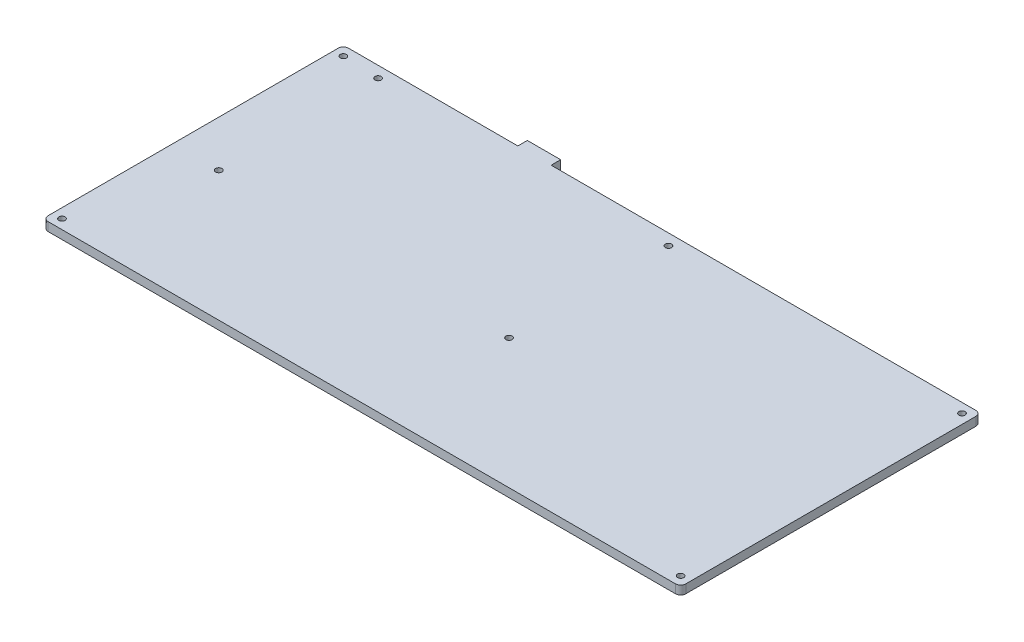
ISO-10303-21;
HEADER;
FILE_DESCRIPTION(('STEP AP214'),'2;1');
FILE_NAME('part.step','',(''),(''),'','','');
FILE_SCHEMA(('AUTOMOTIVE_DESIGN { 1 0 10303 214 1 1 1 1 }'));
ENDSEC;
DATA;
#1=APPLICATION_CONTEXT('core data for automotive mechanical design processes');
#2=APPLICATION_PROTOCOL_DEFINITION('international standard','automotive_design',2000,#1);
#3=PRODUCT_CONTEXT('',#1,'mechanical');
#4=PRODUCT('Part','Part','',(#3));
#5=PRODUCT_RELATED_PRODUCT_CATEGORY('part','',(#4));
#6=PRODUCT_DEFINITION_FORMATION('','',#4);
#7=PRODUCT_DEFINITION_CONTEXT('part definition',#1,'design');
#8=PRODUCT_DEFINITION('design','',#6,#7);
#9=PRODUCT_DEFINITION_SHAPE('','',#8);
#10=(LENGTH_UNIT() NAMED_UNIT(*) SI_UNIT(.MILLI.,.METRE.));
#11=(NAMED_UNIT(*) PLANE_ANGLE_UNIT() SI_UNIT($,.RADIAN.));
#12=(NAMED_UNIT(*) SI_UNIT($,.STERADIAN.) SOLID_ANGLE_UNIT());
#13=UNCERTAINTY_MEASURE_WITH_UNIT(LENGTH_MEASURE(1.E-05),#10,'distance_accuracy_value','');
#14=(GEOMETRIC_REPRESENTATION_CONTEXT(3) GLOBAL_UNCERTAINTY_ASSIGNED_CONTEXT((#13)) GLOBAL_UNIT_ASSIGNED_CONTEXT((#10,
#11,#12)) REPRESENTATION_CONTEXT('',''));
#15=CARTESIAN_POINT('',(0.,0.,0.));
#16=DIRECTION('',(0.,0.,1.));
#17=DIRECTION('',(1.,0.,0.));
#18=AXIS2_PLACEMENT_3D('',#15,#16,#17);
#19=CARTESIAN_POINT('',(0.,0.,0.));
#20=DIRECTION('',(0.,1.,0.));
#21=DIRECTION('',(0.,0.,1.));
#22=AXIS2_PLACEMENT_3D('',#19,#20,#21);
#23=PLANE('',#22);
#24=DIRECTION('',(1.,0.,0.));
#25=VECTOR('',#24,1.);
#26=CARTESIAN_POINT('',(-30.269137665192,0.,-43.6579047044926));
#27=LINE('',#26,#25);
#28=CARTESIAN_POINT('',(-30.269137665192,0.,-43.6579047044926));
#29=VERTEX_POINT('',#28);
#30=CARTESIAN_POINT('',(92.6109493963581,0.,-43.6579047044926));
#31=VERTEX_POINT('',#30);
#32=EDGE_CURVE('E136',#29,#31,#27,.T.);
#33=ORIENTED_EDGE('',*,*,#32,.T.);
#34=CARTESIAN_POINT('',(92.6109493963581,0.,-42.1579047044926));
#35=DIRECTION('',(0.,1.,0.));
#36=DIRECTION('',(0.,0.,1.));
#37=AXIS2_PLACEMENT_3D('',#34,#35,#36);
#38=CIRCLE('',#37,1.5);
#39=CARTESIAN_POINT('',(94.1109493963581,0.,-42.1579047044926));
#40=VERTEX_POINT('',#39);
#41=EDGE_CURVE('E202',#31,#40,#38,.F.);
#42=ORIENTED_EDGE('',*,*,#41,.T.);
#43=DIRECTION('',(0.,0.,-1.));
#44=VECTOR('',#43,1.);
#45=CARTESIAN_POINT('',(94.1109493963581,0.,43.2563883655075));
#46=LINE('',#45,#44);
#47=CARTESIAN_POINT('',(94.1109493963581,0.,41.7563883655075));
#48=VERTEX_POINT('',#47);
#49=EDGE_CURVE('E172',#48,#40,#46,.T.);
#50=ORIENTED_EDGE('',*,*,#49,.F.);
#51=CARTESIAN_POINT('',(92.6109493963581,0.,41.7563883655075));
#52=DIRECTION('',(0.,1.,0.));
#53=DIRECTION('',(0.,0.,1.));
#54=AXIS2_PLACEMENT_3D('',#51,#52,#53);
#55=CIRCLE('',#54,1.5);
#56=CARTESIAN_POINT('',(92.6109493963581,0.,43.2563883655075));
#57=VERTEX_POINT('',#56);
#58=EDGE_CURVE('E200',#48,#57,#55,.F.);
#59=ORIENTED_EDGE('',*,*,#58,.T.);
#60=DIRECTION('',(1.,0.,0.));
#61=VECTOR('',#60,1.);
#62=CARTESIAN_POINT('',(-90.3890506036419,0.,43.2563883655075));
#63=LINE('',#62,#61);
#64=CARTESIAN_POINT('',(-88.8890506036419,0.,43.2563883655075));
#65=VERTEX_POINT('',#64);
#66=EDGE_CURVE('E169',#65,#57,#63,.T.);
#67=ORIENTED_EDGE('',*,*,#66,.F.);
#68=CARTESIAN_POINT('',(-88.8890506036419,0.,41.7563883655075));
#69=DIRECTION('',(0.,1.,0.));
#70=DIRECTION('',(0.,0.,1.));
#71=AXIS2_PLACEMENT_3D('',#68,#69,#70);
#72=CIRCLE('',#71,1.5);
#73=CARTESIAN_POINT('',(-90.3890506036419,0.,41.7563883655075));
#74=VERTEX_POINT('',#73);
#75=EDGE_CURVE('E198',#65,#74,#72,.F.);
#76=ORIENTED_EDGE('',*,*,#75,.T.);
#77=DIRECTION('',(0.,0.,-1.));
#78=VECTOR('',#77,1.);
#79=CARTESIAN_POINT('',(-90.3890506036419,0.,43.2563883655075));
#80=LINE('',#79,#78);
#81=CARTESIAN_POINT('',(-90.3890506036419,0.,-42.1579047044926));
#82=VERTEX_POINT('',#81);
#83=EDGE_CURVE('E187',#74,#82,#80,.T.);
#84=ORIENTED_EDGE('',*,*,#83,.T.);
#85=CARTESIAN_POINT('',(-88.8890506036419,0.,-42.1579047044926));
#86=DIRECTION('',(0.,1.,0.));
#87=DIRECTION('',(0.,0.,1.));
#88=AXIS2_PLACEMENT_3D('',#85,#86,#87);
#89=CIRCLE('',#88,1.5);
#90=CARTESIAN_POINT('',(-88.8890506036419,0.,-43.6579047044926));
#91=VERTEX_POINT('',#90);
#92=EDGE_CURVE('E196',#82,#91,#89,.F.);
#93=ORIENTED_EDGE('',*,*,#92,.T.);
#94=DIRECTION('',(1.,0.,0.));
#95=VECTOR('',#94,1.);
#96=CARTESIAN_POINT('',(-90.3890506036419,0.,-43.6579047044926));
#97=LINE('',#96,#95);
#98=CARTESIAN_POINT('',(-39.909137665192,0.,-43.6579047044926));
#99=VERTEX_POINT('',#98);
#100=EDGE_CURVE('E185',#91,#99,#97,.T.);
#101=ORIENTED_EDGE('',*,*,#100,.T.);
#102=DIRECTION('',(0.,0.,-1.));
#103=VECTOR('',#102,1.);
#104=CARTESIAN_POINT('',(-39.909137665192,0.,-43.6579047044926));
#105=LINE('',#104,#103);
#106=CARTESIAN_POINT('',(-39.909137665192,0.,-46.4079047044925));
#107=VERTEX_POINT('',#106);
#108=EDGE_CURVE('E182',#99,#107,#105,.T.);
#109=ORIENTED_EDGE('',*,*,#108,.T.);
#110=DIRECTION('',(1.,0.,0.));
#111=VECTOR('',#110,1.);
#112=CARTESIAN_POINT('',(-39.909137665192,0.,-46.4079047044925));
#113=LINE('',#112,#111);
#114=CARTESIAN_POINT('',(-30.269137665192,0.,-46.4079047044925));
#115=VERTEX_POINT('',#114);
#116=EDGE_CURVE('E179',#107,#115,#113,.T.);
#117=ORIENTED_EDGE('',*,*,#116,.T.);
#118=DIRECTION('',(0.,0.,-1.));
#119=VECTOR('',#118,1.);
#120=CARTESIAN_POINT('',(-30.269137665192,0.,-43.6579047044926));
#121=LINE('',#120,#119);
#122=EDGE_CURVE('E177',#29,#115,#121,.T.);
#123=ORIENTED_EDGE('',*,*,#122,.F.);
#124=EDGE_LOOP('',(#33,#42,#50,#59,#67,#76,#84,#93,#101,#109,#117,#123));
#125=FACE_BOUND('',#124,.T.);
#126=CARTESIAN_POINT('',(-77.089050603642,0.,-40.4079047044926));
#127=DIRECTION('',(0.,-1.,0.));
#128=DIRECTION('',(0.,0.,-1.));
#129=AXIS2_PLACEMENT_3D('',#126,#127,#128);
#130=CIRCLE('',#129,1.8);
#131=CARTESIAN_POINT('',(-77.089050603642,0.,-42.2079047044925));
#132=VERTEX_POINT('',#131);
#133=EDGE_CURVE('E245',#132,#132,#130,.T.);
#134=ORIENTED_EDGE('',*,*,#133,.F.);
#135=EDGE_LOOP('',(#134));
#136=FACE_BOUND('',#135,.T.);
#137=CARTESIAN_POINT('',(6.91094939635803,0.,-40.4079047044925));
#138=DIRECTION('',(0.,-1.,0.));
#139=DIRECTION('',(0.,0.,-1.));
#140=AXIS2_PLACEMENT_3D('',#137,#138,#139);
#141=CIRCLE('',#140,1.8);
#142=CARTESIAN_POINT('',(6.91094939635803,0.,-42.2079047044925));
#143=VERTEX_POINT('',#142);
#144=EDGE_CURVE('E254',#143,#143,#141,.T.);
#145=ORIENTED_EDGE('',*,*,#144,.F.);
#146=EDGE_LOOP('',(#145));
#147=FACE_BOUND('',#146,.T.);
#148=CARTESIAN_POINT('',(6.91094939635803,0.,5.69609529550746));
#149=DIRECTION('',(0.,-1.,0.));
#150=DIRECTION('',(0.,0.,-1.));
#151=AXIS2_PLACEMENT_3D('',#148,#149,#150);
#152=CIRCLE('',#151,1.8);
#153=CARTESIAN_POINT('',(6.91094939635803,0.,3.89609529550746));
#154=VERTEX_POINT('',#153);
#155=EDGE_CURVE('E263',#154,#154,#152,.T.);
#156=ORIENTED_EDGE('',*,*,#155,.F.);
#157=EDGE_LOOP('',(#156));
#158=FACE_BOUND('',#157,.T.);
#159=CARTESIAN_POINT('',(-77.089050603642,0.,5.69609529550745));
#160=DIRECTION('',(0.,-1.,0.));
#161=DIRECTION('',(0.,0.,-1.));
#162=AXIS2_PLACEMENT_3D('',#159,#160,#161);
#163=CIRCLE('',#162,1.8);
#164=CARTESIAN_POINT('',(-77.089050603642,0.,3.89609529550745));
#165=VERTEX_POINT('',#164);
#166=EDGE_CURVE('E272',#165,#165,#163,.T.);
#167=ORIENTED_EDGE('',*,*,#166,.F.);
#168=EDGE_LOOP('',(#167));
#169=FACE_BOUND('',#168,.T.);
#170=CARTESIAN_POINT('',(-87.6390506036419,0.,-40.9079047044926));
#171=DIRECTION('',(0.,-1.,0.));
#172=DIRECTION('',(0.,0.,-1.));
#173=AXIS2_PLACEMENT_3D('',#170,#171,#172);
#174=CIRCLE('',#173,1.8);
#175=CARTESIAN_POINT('',(-87.6390506036419,0.,-42.7079047044926));
#176=VERTEX_POINT('',#175);
#177=EDGE_CURVE('E281',#176,#176,#174,.T.);
#178=ORIENTED_EDGE('',*,*,#177,.F.);
#179=EDGE_LOOP('',(#178));
#180=FACE_BOUND('',#179,.T.);
#181=CARTESIAN_POINT('',(91.3609493963581,0.,-40.9079047044926));
#182=DIRECTION('',(0.,-1.,0.));
#183=DIRECTION('',(0.,0.,-1.));
#184=AXIS2_PLACEMENT_3D('',#181,#182,#183);
#185=CIRCLE('',#184,1.8);
#186=CARTESIAN_POINT('',(91.3609493963581,0.,-42.7079047044926));
#187=VERTEX_POINT('',#186);
#188=EDGE_CURVE('E290',#187,#187,#185,.T.);
#189=ORIENTED_EDGE('',*,*,#188,.F.);
#190=EDGE_LOOP('',(#189));
#191=FACE_BOUND('',#190,.T.);
#192=CARTESIAN_POINT('',(91.3609493963581,0.,40.5063883655075));
#193=DIRECTION('',(0.,-1.,0.));
#194=DIRECTION('',(0.,0.,-1.));
#195=AXIS2_PLACEMENT_3D('',#192,#193,#194);
#196=CIRCLE('',#195,1.8);
#197=CARTESIAN_POINT('',(91.3609493963581,0.,38.7063883655075));
#198=VERTEX_POINT('',#197);
#199=EDGE_CURVE('E299',#198,#198,#196,.T.);
#200=ORIENTED_EDGE('',*,*,#199,.F.);
#201=EDGE_LOOP('',(#200));
#202=FACE_BOUND('',#201,.T.);
#203=CARTESIAN_POINT('',(-87.6390506036419,0.,40.5063883655075));
#204=DIRECTION('',(0.,-1.,0.));
#205=DIRECTION('',(0.,0.,-1.));
#206=AXIS2_PLACEMENT_3D('',#203,#204,#205);
#207=CIRCLE('',#206,1.8);
#208=CARTESIAN_POINT('',(-87.6390506036419,0.,38.7063883655075));
#209=VERTEX_POINT('',#208);
#210=EDGE_CURVE('E308',#209,#209,#207,.T.);
#211=ORIENTED_EDGE('',*,*,#210,.F.);
#212=EDGE_LOOP('',(#211));
#213=FACE_BOUND('',#212,.T.);
#214=ADVANCED_FACE('F39',(#125,#136,#147,#158,#169,#180,#191,#202,#213),#23,.F.);
#215=CARTESIAN_POINT('',(-90.3890506036419,2.5,43.2563883655075));
#216=DIRECTION('',(0.,0.,-1.));
#217=DIRECTION('',(-1.,0.,0.));
#218=AXIS2_PLACEMENT_3D('',#215,#216,#217);
#219=PLANE('',#218);
#220=ORIENTED_EDGE('',*,*,#66,.T.);
#221=DIRECTION('',(0.,-1.,0.));
#222=VECTOR('',#221,1.);
#223=CARTESIAN_POINT('',(92.6109493963581,2.5,43.2563883655075));
#224=LINE('',#223,#222);
#225=CARTESIAN_POINT('',(92.6109493963581,2.5,43.2563883655075));
#226=VERTEX_POINT('',#225);
#227=EDGE_CURVE('E218',#57,#226,#224,.F.);
#228=ORIENTED_EDGE('',*,*,#227,.T.);
#229=DIRECTION('',(1.,0.,0.));
#230=VECTOR('',#229,1.);
#231=CARTESIAN_POINT('',(-90.3890506036419,2.5,43.2563883655075));
#232=LINE('',#231,#230);
#233=CARTESIAN_POINT('',(-88.8890506036419,2.5,43.2563883655075));
#234=VERTEX_POINT('',#233);
#235=EDGE_CURVE('E156',#234,#226,#232,.T.);
#236=ORIENTED_EDGE('',*,*,#235,.F.);
#237=DIRECTION('',(0.,-1.,0.));
#238=VECTOR('',#237,1.);
#239=CARTESIAN_POINT('',(-88.8890506036419,0.,43.2563883655075));
#240=LINE('',#239,#238);
#241=EDGE_CURVE('E215',#234,#65,#240,.T.);
#242=ORIENTED_EDGE('',*,*,#241,.T.);
#243=EDGE_LOOP('',(#220,#228,#236,#242));
#244=FACE_BOUND('',#243,.T.);
#245=ADVANCED_FACE('F235',(#244),#219,.F.);
#246=CARTESIAN_POINT('',(94.1109493963581,2.5,43.2563883655075));
#247=DIRECTION('',(-1.,0.,0.));
#248=DIRECTION('',(0.,0.,1.));
#249=AXIS2_PLACEMENT_3D('',#246,#247,#248);
#250=PLANE('',#249);
#251=ORIENTED_EDGE('',*,*,#49,.T.);
#252=DIRECTION('',(0.,-1.,0.));
#253=VECTOR('',#252,1.);
#254=CARTESIAN_POINT('',(94.1109493963581,2.5,-42.1579047044926));
#255=LINE('',#254,#253);
#256=CARTESIAN_POINT('',(94.1109493963581,2.5,-42.1579047044926));
#257=VERTEX_POINT('',#256);
#258=EDGE_CURVE('E207',#40,#257,#255,.F.);
#259=ORIENTED_EDGE('',*,*,#258,.T.);
#260=DIRECTION('',(0.,0.,-1.));
#261=VECTOR('',#260,1.);
#262=CARTESIAN_POINT('',(94.1109493963581,2.5,43.2563883655075));
#263=LINE('',#262,#261);
#264=CARTESIAN_POINT('',(94.1109493963581,2.5,41.7563883655075));
#265=VERTEX_POINT('',#264);
#266=EDGE_CURVE('E154',#265,#257,#263,.T.);
#267=ORIENTED_EDGE('',*,*,#266,.F.);
#268=DIRECTION('',(0.,-1.,0.));
#269=VECTOR('',#268,1.);
#270=CARTESIAN_POINT('',(94.1109493963581,2.5,41.7563883655075));
#271=LINE('',#270,#269);
#272=EDGE_CURVE('E204',#265,#48,#271,.T.);
#273=ORIENTED_EDGE('',*,*,#272,.T.);
#274=EDGE_LOOP('',(#251,#259,#267,#273));
#275=FACE_BOUND('',#274,.T.);
#276=ADVANCED_FACE('F319',(#275),#250,.F.);
#277=CARTESIAN_POINT('',(-30.269137665192,2.5,-43.6579047044926));
#278=DIRECTION('',(0.,0.,-1.));
#279=DIRECTION('',(-1.,0.,0.));
#280=AXIS2_PLACEMENT_3D('',#277,#278,#279);
#281=PLANE('',#280);
#282=DIRECTION('',(1.,0.,0.));
#283=VECTOR('',#282,1.);
#284=CARTESIAN_POINT('',(-30.269137665192,2.5,-43.6579047044926));
#285=LINE('',#284,#283);
#286=CARTESIAN_POINT('',(-30.269137665192,2.5,-43.6579047044926));
#287=VERTEX_POINT('',#286);
#288=CARTESIAN_POINT('',(92.6109493963581,2.5,-43.6579047044926));
#289=VERTEX_POINT('',#288);
#290=EDGE_CURVE('E133',#287,#289,#285,.T.);
#291=ORIENTED_EDGE('',*,*,#290,.T.);
#292=DIRECTION('',(0.,-1.,0.));
#293=VECTOR('',#292,1.);
#294=CARTESIAN_POINT('',(92.6109493963581,0.,-43.6579047044926));
#295=LINE('',#294,#293);
#296=EDGE_CURVE('E140',#289,#31,#295,.T.);
#297=ORIENTED_EDGE('',*,*,#296,.T.);
#298=ORIENTED_EDGE('',*,*,#32,.F.);
#299=DIRECTION('',(0.,-1.,0.));
#300=VECTOR('',#299,1.);
#301=CARTESIAN_POINT('',(-30.269137665192,2.5,-43.6579047044926));
#302=LINE('',#301,#300);
#303=EDGE_CURVE('E128',#287,#29,#302,.T.);
#304=ORIENTED_EDGE('',*,*,#303,.F.);
#305=EDGE_LOOP('',(#291,#297,#298,#304));
#306=FACE_BOUND('',#305,.T.);
#307=ADVANCED_FACE('F130',(#306),#281,.T.);
#308=CARTESIAN_POINT('',(-30.269137665192,2.5,-43.6579047044926));
#309=DIRECTION('',(-1.,0.,0.));
#310=DIRECTION('',(0.,0.,1.));
#311=AXIS2_PLACEMENT_3D('',#308,#309,#310);
#312=PLANE('',#311);
#313=ORIENTED_EDGE('',*,*,#122,.T.);
#314=DIRECTION('',(0.,-1.,0.));
#315=VECTOR('',#314,1.);
#316=CARTESIAN_POINT('',(-30.269137665192,2.5,-46.4079047044925));
#317=LINE('',#316,#315);
#318=CARTESIAN_POINT('',(-30.269137665192,2.5,-46.4079047044925));
#319=VERTEX_POINT('',#318);
#320=EDGE_CURVE('E141',#319,#115,#317,.T.);
#321=ORIENTED_EDGE('',*,*,#320,.F.);
#322=DIRECTION('',(0.,0.,-1.));
#323=VECTOR('',#322,1.);
#324=CARTESIAN_POINT('',(-30.269137665192,2.5,-43.6579047044926));
#325=LINE('',#324,#323);
#326=EDGE_CURVE('E144',#287,#319,#325,.T.);
#327=ORIENTED_EDGE('',*,*,#326,.F.);
#328=ORIENTED_EDGE('',*,*,#303,.T.);
#329=EDGE_LOOP('',(#313,#321,#327,#328));
#330=FACE_BOUND('',#329,.T.);
#331=ADVANCED_FACE('F145',(#330),#312,.F.);
#332=CARTESIAN_POINT('',(-39.909137665192,2.5,-46.4079047044925));
#333=DIRECTION('',(0.,0.,-1.));
#334=DIRECTION('',(-1.,0.,0.));
#335=AXIS2_PLACEMENT_3D('',#332,#333,#334);
#336=PLANE('',#335);
#337=ORIENTED_EDGE('',*,*,#116,.F.);
#338=DIRECTION('',(0.,-1.,0.));
#339=VECTOR('',#338,1.);
#340=CARTESIAN_POINT('',(-39.909137665192,2.5,-46.4079047044925));
#341=LINE('',#340,#339);
#342=CARTESIAN_POINT('',(-39.909137665192,2.5,-46.4079047044925));
#343=VERTEX_POINT('',#342);
#344=EDGE_CURVE('E192',#343,#107,#341,.T.);
#345=ORIENTED_EDGE('',*,*,#344,.F.);
#346=DIRECTION('',(1.,0.,0.));
#347=VECTOR('',#346,1.);
#348=CARTESIAN_POINT('',(-39.909137665192,2.5,-46.4079047044925));
#349=LINE('',#348,#347);
#350=EDGE_CURVE('E148',#343,#319,#349,.T.);
#351=ORIENTED_EDGE('',*,*,#350,.T.);
#352=ORIENTED_EDGE('',*,*,#320,.T.);
#353=EDGE_LOOP('',(#337,#345,#351,#352));
#354=FACE_BOUND('',#353,.T.);
#355=ADVANCED_FACE('F333',(#354),#336,.T.);
#356=CARTESIAN_POINT('',(-39.909137665192,2.5,-43.6579047044926));
#357=DIRECTION('',(-1.,0.,0.));
#358=DIRECTION('',(0.,0.,1.));
#359=AXIS2_PLACEMENT_3D('',#356,#357,#358);
#360=PLANE('',#359);
#361=ORIENTED_EDGE('',*,*,#108,.F.);
#362=DIRECTION('',(0.,-1.,0.));
#363=VECTOR('',#362,1.);
#364=CARTESIAN_POINT('',(-39.909137665192,2.5,-43.6579047044926));
#365=LINE('',#364,#363);
#366=CARTESIAN_POINT('',(-39.909137665192,2.5,-43.6579047044926));
#367=VERTEX_POINT('',#366);
#368=EDGE_CURVE('E168',#367,#99,#365,.T.);
#369=ORIENTED_EDGE('',*,*,#368,.F.);
#370=DIRECTION('',(0.,0.,-1.));
#371=VECTOR('',#370,1.);
#372=CARTESIAN_POINT('',(-39.909137665192,2.5,-43.6579047044926));
#373=LINE('',#372,#371);
#374=EDGE_CURVE('E161',#367,#343,#373,.T.);
#375=ORIENTED_EDGE('',*,*,#374,.T.);
#376=ORIENTED_EDGE('',*,*,#344,.T.);
#377=EDGE_LOOP('',(#361,#369,#375,#376));
#378=FACE_BOUND('',#377,.T.);
#379=ADVANCED_FACE('F329',(#378),#360,.T.);
#380=CARTESIAN_POINT('',(-90.3890506036419,2.5,-43.6579047044926));
#381=DIRECTION('',(0.,0.,-1.));
#382=DIRECTION('',(-1.,0.,0.));
#383=AXIS2_PLACEMENT_3D('',#380,#381,#382);
#384=PLANE('',#383);
#385=ORIENTED_EDGE('',*,*,#100,.F.);
#386=DIRECTION('',(0.,-1.,0.));
#387=VECTOR('',#386,1.);
#388=CARTESIAN_POINT('',(-88.8890506036419,2.5,-43.6579047044926));
#389=LINE('',#388,#387);
#390=CARTESIAN_POINT('',(-88.8890506036419,2.5,-43.6579047044926));
#391=VERTEX_POINT('',#390);
#392=EDGE_CURVE('E11',#91,#391,#389,.F.);
#393=ORIENTED_EDGE('',*,*,#392,.T.);
#394=DIRECTION('',(1.,0.,0.));
#395=VECTOR('',#394,1.);
#396=CARTESIAN_POINT('',(-90.3890506036419,2.5,-43.6579047044926));
#397=LINE('',#396,#395);
#398=EDGE_CURVE('E164',#391,#367,#397,.T.);
#399=ORIENTED_EDGE('',*,*,#398,.T.);
#400=ORIENTED_EDGE('',*,*,#368,.T.);
#401=EDGE_LOOP('',(#385,#393,#399,#400));
#402=FACE_BOUND('',#401,.T.);
#403=ADVANCED_FACE('F326',(#402),#384,.T.);
#404=CARTESIAN_POINT('',(-90.3890506036419,2.5,43.2563883655075));
#405=DIRECTION('',(-1.,0.,0.));
#406=DIRECTION('',(0.,0.,1.));
#407=AXIS2_PLACEMENT_3D('',#404,#405,#406);
#408=PLANE('',#407);
#409=ORIENTED_EDGE('',*,*,#83,.F.);
#410=DIRECTION('',(0.,-1.,0.));
#411=VECTOR('',#410,1.);
#412=CARTESIAN_POINT('',(-90.3890506036419,2.5,41.7563883655075));
#413=LINE('',#412,#411);
#414=CARTESIAN_POINT('',(-90.3890506036419,2.5,41.7563883655075));
#415=VERTEX_POINT('',#414);
#416=EDGE_CURVE('E47',#74,#415,#413,.F.);
#417=ORIENTED_EDGE('',*,*,#416,.T.);
#418=DIRECTION('',(0.,0.,-1.));
#419=VECTOR('',#418,1.);
#420=CARTESIAN_POINT('',(-90.3890506036419,2.5,43.2563883655075));
#421=LINE('',#420,#419);
#422=CARTESIAN_POINT('',(-90.3890506036419,2.5,-42.1579047044926));
#423=VERTEX_POINT('',#422);
#424=EDGE_CURVE('E166',#415,#423,#421,.T.);
#425=ORIENTED_EDGE('',*,*,#424,.T.);
#426=DIRECTION('',(0.,-1.,0.));
#427=VECTOR('',#426,1.);
#428=CARTESIAN_POINT('',(-90.3890506036419,2.5,-42.1579047044926));
#429=LINE('',#428,#427);
#430=EDGE_CURVE('E220',#423,#82,#429,.T.);
#431=ORIENTED_EDGE('',*,*,#430,.T.);
#432=EDGE_LOOP('',(#409,#417,#425,#431));
#433=FACE_BOUND('',#432,.T.);
#434=ADVANCED_FACE('F223',(#433),#408,.T.);
#435=CARTESIAN_POINT('',(0.,2.5,0.));
#436=DIRECTION('',(0.,1.,0.));
#437=DIRECTION('',(0.,0.,1.));
#438=AXIS2_PLACEMENT_3D('',#435,#436,#437);
#439=PLANE('',#438);
#440=CARTESIAN_POINT('',(-87.6390506036419,2.5,40.5063883655075));
#441=DIRECTION('',(0.,1.,0.));
#442=DIRECTION('',(0.,0.,1.));
#443=AXIS2_PLACEMENT_3D('',#440,#441,#442);
#444=CIRCLE('',#443,0.899999999999998);
#445=CARTESIAN_POINT('',(-87.6390506036419,2.5,41.4063883655075));
#446=VERTEX_POINT('',#445);
#447=EDGE_CURVE('E302',#446,#446,#444,.T.);
#448=ORIENTED_EDGE('',*,*,#447,.F.);
#449=EDGE_LOOP('',(#448));
#450=FACE_BOUND('',#449,.T.);
#451=CARTESIAN_POINT('',(91.3609493963581,2.5,40.5063883655075));
#452=DIRECTION('',(0.,1.,0.));
#453=DIRECTION('',(0.,0.,1.));
#454=AXIS2_PLACEMENT_3D('',#451,#452,#453);
#455=CIRCLE('',#454,0.899999999999998);
#456=CARTESIAN_POINT('',(91.3609493963581,2.5,41.4063883655075));
#457=VERTEX_POINT('',#456);
#458=EDGE_CURVE('E293',#457,#457,#455,.T.);
#459=ORIENTED_EDGE('',*,*,#458,.F.);
#460=EDGE_LOOP('',(#459));
#461=FACE_BOUND('',#460,.T.);
#462=CARTESIAN_POINT('',(91.3609493963581,2.5,-40.9079047044926));
#463=DIRECTION('',(0.,1.,0.));
#464=DIRECTION('',(0.,0.,1.));
#465=AXIS2_PLACEMENT_3D('',#462,#463,#464);
#466=CIRCLE('',#465,0.899999999999998);
#467=CARTESIAN_POINT('',(91.3609493963581,2.5,-40.0079047044926));
#468=VERTEX_POINT('',#467);
#469=EDGE_CURVE('E284',#468,#468,#466,.T.);
#470=ORIENTED_EDGE('',*,*,#469,.F.);
#471=EDGE_LOOP('',(#470));
#472=FACE_BOUND('',#471,.T.);
#473=CARTESIAN_POINT('',(-87.6390506036419,2.5,-40.9079047044926));
#474=DIRECTION('',(0.,1.,0.));
#475=DIRECTION('',(0.,0.,1.));
#476=AXIS2_PLACEMENT_3D('',#473,#474,#475);
#477=CIRCLE('',#476,0.899999999999998);
#478=CARTESIAN_POINT('',(-87.6390506036419,2.5,-40.0079047044926));
#479=VERTEX_POINT('',#478);
#480=EDGE_CURVE('E275',#479,#479,#477,.T.);
#481=ORIENTED_EDGE('',*,*,#480,.F.);
#482=EDGE_LOOP('',(#481));
#483=FACE_BOUND('',#482,.T.);
#484=CARTESIAN_POINT('',(-77.089050603642,2.5,5.69609529550745));
#485=DIRECTION('',(0.,1.,0.));
#486=DIRECTION('',(0.,0.,1.));
#487=AXIS2_PLACEMENT_3D('',#484,#485,#486);
#488=CIRCLE('',#487,0.899999999999998);
#489=CARTESIAN_POINT('',(-77.089050603642,2.5,6.59609529550745));
#490=VERTEX_POINT('',#489);
#491=EDGE_CURVE('E266',#490,#490,#488,.T.);
#492=ORIENTED_EDGE('',*,*,#491,.F.);
#493=EDGE_LOOP('',(#492));
#494=FACE_BOUND('',#493,.T.);
#495=CARTESIAN_POINT('',(6.91094939635803,2.5,5.69609529550746));
#496=DIRECTION('',(0.,1.,0.));
#497=DIRECTION('',(0.,0.,1.));
#498=AXIS2_PLACEMENT_3D('',#495,#496,#497);
#499=CIRCLE('',#498,0.899999999999999);
#500=CARTESIAN_POINT('',(6.91094939635803,2.5,6.59609529550745));
#501=VERTEX_POINT('',#500);
#502=EDGE_CURVE('E257',#501,#501,#499,.T.);
#503=ORIENTED_EDGE('',*,*,#502,.F.);
#504=EDGE_LOOP('',(#503));
#505=FACE_BOUND('',#504,.T.);
#506=CARTESIAN_POINT('',(6.91094939635803,2.5,-40.4079047044925));
#507=DIRECTION('',(0.,1.,0.));
#508=DIRECTION('',(0.,0.,1.));
#509=AXIS2_PLACEMENT_3D('',#506,#507,#508);
#510=CIRCLE('',#509,0.899999999999999);
#511=CARTESIAN_POINT('',(6.91094939635803,2.5,-39.5079047044925));
#512=VERTEX_POINT('',#511);
#513=EDGE_CURVE('E248',#512,#512,#510,.T.);
#514=ORIENTED_EDGE('',*,*,#513,.F.);
#515=EDGE_LOOP('',(#514));
#516=FACE_BOUND('',#515,.T.);
#517=CARTESIAN_POINT('',(-77.089050603642,2.5,-40.4079047044926));
#518=DIRECTION('',(0.,1.,0.));
#519=DIRECTION('',(0.,0.,1.));
#520=AXIS2_PLACEMENT_3D('',#517,#518,#519);
#521=CIRCLE('',#520,0.899999999999998);
#522=CARTESIAN_POINT('',(-77.089050603642,2.5,-39.5079047044926));
#523=VERTEX_POINT('',#522);
#524=EDGE_CURVE('E173',#523,#523,#521,.T.);
#525=ORIENTED_EDGE('',*,*,#524,.F.);
#526=EDGE_LOOP('',(#525));
#527=FACE_BOUND('',#526,.T.);
#528=ORIENTED_EDGE('',*,*,#266,.T.);
#529=CARTESIAN_POINT('',(92.6109493963581,2.5,-42.1579047044926));
#530=DIRECTION('',(0.,1.,0.));
#531=DIRECTION('',(0.,0.,1.));
#532=AXIS2_PLACEMENT_3D('',#529,#530,#531);
#533=CIRCLE('',#532,1.5);
#534=EDGE_CURVE('E153',#257,#289,#533,.T.);
#535=ORIENTED_EDGE('',*,*,#534,.T.);
#536=ORIENTED_EDGE('',*,*,#290,.F.);
#537=ORIENTED_EDGE('',*,*,#326,.T.);
#538=ORIENTED_EDGE('',*,*,#350,.F.);
#539=ORIENTED_EDGE('',*,*,#374,.F.);
#540=ORIENTED_EDGE('',*,*,#398,.F.);
#541=CARTESIAN_POINT('',(-88.8890506036419,2.5,-42.1579047044926));
#542=DIRECTION('',(0.,1.,0.));
#543=DIRECTION('',(0.,0.,1.));
#544=AXIS2_PLACEMENT_3D('',#541,#542,#543);
#545=CIRCLE('',#544,1.5);
#546=EDGE_CURVE('E54',#391,#423,#545,.T.);
#547=ORIENTED_EDGE('',*,*,#546,.T.);
#548=ORIENTED_EDGE('',*,*,#424,.F.);
#549=CARTESIAN_POINT('',(-88.8890506036419,2.5,41.7563883655075));
#550=DIRECTION('',(0.,1.,0.));
#551=DIRECTION('',(0.,0.,1.));
#552=AXIS2_PLACEMENT_3D('',#549,#550,#551);
#553=CIRCLE('',#552,1.5);
#554=EDGE_CURVE('E210',#415,#234,#553,.T.);
#555=ORIENTED_EDGE('',*,*,#554,.T.);
#556=ORIENTED_EDGE('',*,*,#235,.T.);
#557=CARTESIAN_POINT('',(92.6109493963581,2.5,41.7563883655075));
#558=DIRECTION('',(0.,1.,0.));
#559=DIRECTION('',(0.,0.,1.));
#560=AXIS2_PLACEMENT_3D('',#557,#558,#559);
#561=CIRCLE('',#560,1.5);
#562=EDGE_CURVE('E212',#226,#265,#561,.T.);
#563=ORIENTED_EDGE('',*,*,#562,.T.);
#564=EDGE_LOOP('',(#528,#535,#536,#537,#538,#539,#540,#547,#548,#555,#556,#563));
#565=FACE_BOUND('',#564,.T.);
#566=ADVANCED_FACE('F151',(#450,#461,#472,#483,#494,#505,#516,#527,#565),#439,.T.);
#567=CARTESIAN_POINT('',(92.6109493963581,2.5,-42.1579047044926));
#568=DIRECTION('',(0.,1.,0.));
#569=DIRECTION('',(0.,0.,1.));
#570=AXIS2_PLACEMENT_3D('',#567,#568,#569);
#571=CYLINDRICAL_SURFACE('',#570,1.5);
#572=ORIENTED_EDGE('',*,*,#534,.F.);
#573=ORIENTED_EDGE('',*,*,#258,.F.);
#574=ORIENTED_EDGE('',*,*,#41,.F.);
#575=ORIENTED_EDGE('',*,*,#296,.F.);
#576=EDGE_LOOP('',(#572,#573,#574,#575));
#577=FACE_BOUND('',#576,.T.);
#578=ADVANCED_FACE('F345',(#577),#571,.T.);
#579=CARTESIAN_POINT('',(92.6109493963581,2.5,41.7563883655075));
#580=DIRECTION('',(0.,-1.,0.));
#581=DIRECTION('',(0.,0.,-1.));
#582=AXIS2_PLACEMENT_3D('',#579,#580,#581);
#583=CYLINDRICAL_SURFACE('',#582,1.5);
#584=ORIENTED_EDGE('',*,*,#562,.F.);
#585=ORIENTED_EDGE('',*,*,#227,.F.);
#586=ORIENTED_EDGE('',*,*,#58,.F.);
#587=ORIENTED_EDGE('',*,*,#272,.F.);
#588=EDGE_LOOP('',(#584,#585,#586,#587));
#589=FACE_BOUND('',#588,.T.);
#590=ADVANCED_FACE('F348',(#589),#583,.T.);
#591=CARTESIAN_POINT('',(-88.8890506036419,2.5,41.7563883655075));
#592=DIRECTION('',(0.,1.,0.));
#593=DIRECTION('',(0.,0.,1.));
#594=AXIS2_PLACEMENT_3D('',#591,#592,#593);
#595=CYLINDRICAL_SURFACE('',#594,1.5);
#596=ORIENTED_EDGE('',*,*,#554,.F.);
#597=ORIENTED_EDGE('',*,*,#416,.F.);
#598=ORIENTED_EDGE('',*,*,#75,.F.);
#599=ORIENTED_EDGE('',*,*,#241,.F.);
#600=EDGE_LOOP('',(#596,#597,#598,#599));
#601=FACE_BOUND('',#600,.T.);
#602=ADVANCED_FACE('F232',(#601),#595,.T.);
#603=CARTESIAN_POINT('',(-88.8890506036419,2.5,-42.1579047044926));
#604=DIRECTION('',(0.,-1.,0.));
#605=DIRECTION('',(0.,0.,-1.));
#606=AXIS2_PLACEMENT_3D('',#603,#604,#605);
#607=CYLINDRICAL_SURFACE('',#606,1.5);
#608=ORIENTED_EDGE('',*,*,#546,.F.);
#609=ORIENTED_EDGE('',*,*,#392,.F.);
#610=ORIENTED_EDGE('',*,*,#92,.F.);
#611=ORIENTED_EDGE('',*,*,#430,.F.);
#612=EDGE_LOOP('',(#608,#609,#610,#611));
#613=FACE_BOUND('',#612,.T.);
#614=ADVANCED_FACE('F41',(#613),#607,.T.);
#615=CARTESIAN_POINT('',(-77.089050603642,0.,-40.4079047044926));
#616=DIRECTION('',(0.,-1.,0.));
#617=DIRECTION('',(0.,0.,-1.));
#618=AXIS2_PLACEMENT_3D('',#615,#616,#617);
#619=CYLINDRICAL_SURFACE('',#618,0.899999999999998);
#620=CARTESIAN_POINT('',(-77.089050603642,0.900000000000001,-40.4079047044926));
#621=DIRECTION('',(0.,-1.,0.));
#622=DIRECTION('',(0.,0.,-1.));
#623=AXIS2_PLACEMENT_3D('',#620,#621,#622);
#624=CIRCLE('',#623,0.899999999999998);
#625=CARTESIAN_POINT('',(-77.089050603642,0.900000000000001,-41.3079047044926));
#626=VERTEX_POINT('',#625);
#627=EDGE_CURVE('E242',#626,#626,#624,.T.);
#628=ORIENTED_EDGE('',*,*,#627,.T.);
#629=EDGE_LOOP('',(#628));
#630=FACE_BOUND('',#629,.T.);
#631=ORIENTED_EDGE('',*,*,#524,.T.);
#632=EDGE_LOOP('',(#631));
#633=FACE_BOUND('',#632,.T.);
#634=ADVANCED_FACE('F356',(#630,#633),#619,.F.);
#635=CARTESIAN_POINT('',(-77.089050603642,0.,-40.4079047044926));
#636=DIRECTION('',(0.,-1.,0.));
#637=DIRECTION('',(0.,0.,-1.));
#638=AXIS2_PLACEMENT_3D('',#635,#636,#637);
#639=CONICAL_SURFACE('',#638,1.8,0.785398163397445);
#640=ORIENTED_EDGE('',*,*,#627,.F.);
#641=EDGE_LOOP('',(#640));
#642=FACE_BOUND('',#641,.T.);
#643=ORIENTED_EDGE('',*,*,#133,.T.);
#644=EDGE_LOOP('',(#643));
#645=FACE_BOUND('',#644,.T.);
#646=ADVANCED_FACE('F360',(#642,#645),#639,.F.);
#647=CARTESIAN_POINT('',(6.91094939635803,0.,-40.4079047044925));
#648=DIRECTION('',(0.,-1.,0.));
#649=DIRECTION('',(0.,0.,-1.));
#650=AXIS2_PLACEMENT_3D('',#647,#648,#649);
#651=CYLINDRICAL_SURFACE('',#650,0.899999999999999);
#652=CARTESIAN_POINT('',(6.91094939635803,0.900000000000001,-40.4079047044925));
#653=DIRECTION('',(0.,-1.,0.));
#654=DIRECTION('',(0.,0.,-1.));
#655=AXIS2_PLACEMENT_3D('',#652,#653,#654);
#656=CIRCLE('',#655,0.899999999999998);
#657=CARTESIAN_POINT('',(6.91094939635803,0.900000000000001,-41.3079047044925));
#658=VERTEX_POINT('',#657);
#659=EDGE_CURVE('E251',#658,#658,#656,.T.);
#660=ORIENTED_EDGE('',*,*,#659,.T.);
#661=EDGE_LOOP('',(#660));
#662=FACE_BOUND('',#661,.T.);
#663=ORIENTED_EDGE('',*,*,#513,.T.);
#664=EDGE_LOOP('',(#663));
#665=FACE_BOUND('',#664,.T.);
#666=ADVANCED_FACE('F374',(#662,#665),#651,.F.);
#667=CARTESIAN_POINT('',(6.91094939635803,0.,-40.4079047044925));
#668=DIRECTION('',(0.,-1.,0.));
#669=DIRECTION('',(0.,0.,-1.));
#670=AXIS2_PLACEMENT_3D('',#667,#668,#669);
#671=CONICAL_SURFACE('',#670,1.8,0.785398163397447);
#672=ORIENTED_EDGE('',*,*,#659,.F.);
#673=EDGE_LOOP('',(#672));
#674=FACE_BOUND('',#673,.T.);
#675=ORIENTED_EDGE('',*,*,#144,.T.);
#676=EDGE_LOOP('',(#675));
#677=FACE_BOUND('',#676,.T.);
#678=ADVANCED_FACE('F381',(#674,#677),#671,.F.);
#679=CARTESIAN_POINT('',(6.91094939635803,0.,5.69609529550746));
#680=DIRECTION('',(0.,-1.,0.));
#681=DIRECTION('',(0.,0.,-1.));
#682=AXIS2_PLACEMENT_3D('',#679,#680,#681);
#683=CYLINDRICAL_SURFACE('',#682,0.899999999999999);
#684=CARTESIAN_POINT('',(6.91094939635803,0.900000000000001,5.69609529550746));
#685=DIRECTION('',(0.,-1.,0.));
#686=DIRECTION('',(0.,0.,-1.));
#687=AXIS2_PLACEMENT_3D('',#684,#685,#686);
#688=CIRCLE('',#687,0.899999999999998);
#689=CARTESIAN_POINT('',(6.91094939635803,0.900000000000001,4.79609529550746));
#690=VERTEX_POINT('',#689);
#691=EDGE_CURVE('E260',#690,#690,#688,.T.);
#692=ORIENTED_EDGE('',*,*,#691,.T.);
#693=EDGE_LOOP('',(#692));
#694=FACE_BOUND('',#693,.T.);
#695=ORIENTED_EDGE('',*,*,#502,.T.);
#696=EDGE_LOOP('',(#695));
#697=FACE_BOUND('',#696,.T.);
#698=ADVANCED_FACE('F385',(#694,#697),#683,.F.);
#699=CARTESIAN_POINT('',(6.91094939635803,0.,5.69609529550746));
#700=DIRECTION('',(0.,-1.,0.));
#701=DIRECTION('',(0.,0.,-1.));
#702=AXIS2_PLACEMENT_3D('',#699,#700,#701);
#703=CONICAL_SURFACE('',#702,1.8,0.785398163397447);
#704=ORIENTED_EDGE('',*,*,#691,.F.);
#705=EDGE_LOOP('',(#704));
#706=FACE_BOUND('',#705,.T.);
#707=ORIENTED_EDGE('',*,*,#155,.T.);
#708=EDGE_LOOP('',(#707));
#709=FACE_BOUND('',#708,.T.);
#710=ADVANCED_FACE('F389',(#706,#709),#703,.F.);
#711=CARTESIAN_POINT('',(-77.089050603642,0.,5.69609529550745));
#712=DIRECTION('',(0.,-1.,0.));
#713=DIRECTION('',(0.,0.,-1.));
#714=AXIS2_PLACEMENT_3D('',#711,#712,#713);
#715=CYLINDRICAL_SURFACE('',#714,0.899999999999998);
#716=CARTESIAN_POINT('',(-77.089050603642,0.900000000000001,5.69609529550745));
#717=DIRECTION('',(0.,-1.,0.));
#718=DIRECTION('',(0.,0.,-1.));
#719=AXIS2_PLACEMENT_3D('',#716,#717,#718);
#720=CIRCLE('',#719,0.899999999999998);
#721=CARTESIAN_POINT('',(-77.089050603642,0.900000000000001,4.79609529550745));
#722=VERTEX_POINT('',#721);
#723=EDGE_CURVE('E269',#722,#722,#720,.T.);
#724=ORIENTED_EDGE('',*,*,#723,.T.);
#725=EDGE_LOOP('',(#724));
#726=FACE_BOUND('',#725,.T.);
#727=ORIENTED_EDGE('',*,*,#491,.T.);
#728=EDGE_LOOP('',(#727));
#729=FACE_BOUND('',#728,.T.);
#730=ADVANCED_FACE('F393',(#726,#729),#715,.F.);
#731=CARTESIAN_POINT('',(-77.089050603642,0.,5.69609529550745));
#732=DIRECTION('',(0.,-1.,0.));
#733=DIRECTION('',(0.,0.,-1.));
#734=AXIS2_PLACEMENT_3D('',#731,#732,#733);
#735=CONICAL_SURFACE('',#734,1.8,0.785398163397445);
#736=ORIENTED_EDGE('',*,*,#723,.F.);
#737=EDGE_LOOP('',(#736));
#738=FACE_BOUND('',#737,.T.);
#739=ORIENTED_EDGE('',*,*,#166,.T.);
#740=EDGE_LOOP('',(#739));
#741=FACE_BOUND('',#740,.T.);
#742=ADVANCED_FACE('F397',(#738,#741),#735,.F.);
#743=CARTESIAN_POINT('',(-87.6390506036419,0.,-40.9079047044926));
#744=DIRECTION('',(0.,-1.,0.));
#745=DIRECTION('',(0.,0.,-1.));
#746=AXIS2_PLACEMENT_3D('',#743,#744,#745);
#747=CYLINDRICAL_SURFACE('',#746,0.899999999999998);
#748=CARTESIAN_POINT('',(-87.6390506036419,0.900000000000001,-40.9079047044926));
#749=DIRECTION('',(0.,-1.,0.));
#750=DIRECTION('',(0.,0.,-1.));
#751=AXIS2_PLACEMENT_3D('',#748,#749,#750);
#752=CIRCLE('',#751,0.899999999999998);
#753=CARTESIAN_POINT('',(-87.6390506036419,0.900000000000001,-41.8079047044926));
#754=VERTEX_POINT('',#753);
#755=EDGE_CURVE('E278',#754,#754,#752,.T.);
#756=ORIENTED_EDGE('',*,*,#755,.T.);
#757=EDGE_LOOP('',(#756));
#758=FACE_BOUND('',#757,.T.);
#759=ORIENTED_EDGE('',*,*,#480,.T.);
#760=EDGE_LOOP('',(#759));
#761=FACE_BOUND('',#760,.T.);
#762=ADVANCED_FACE('F401',(#758,#761),#747,.F.);
#763=CARTESIAN_POINT('',(-87.6390506036419,0.,-40.9079047044926));
#764=DIRECTION('',(0.,-1.,0.));
#765=DIRECTION('',(0.,0.,-1.));
#766=AXIS2_PLACEMENT_3D('',#763,#764,#765);
#767=CONICAL_SURFACE('',#766,1.8,0.785398163397445);
#768=ORIENTED_EDGE('',*,*,#755,.F.);
#769=EDGE_LOOP('',(#768));
#770=FACE_BOUND('',#769,.T.);
#771=ORIENTED_EDGE('',*,*,#177,.T.);
#772=EDGE_LOOP('',(#771));
#773=FACE_BOUND('',#772,.T.);
#774=ADVANCED_FACE('F405',(#770,#773),#767,.F.);
#775=CARTESIAN_POINT('',(91.3609493963581,0.,-40.9079047044926));
#776=DIRECTION('',(0.,-1.,0.));
#777=DIRECTION('',(0.,0.,-1.));
#778=AXIS2_PLACEMENT_3D('',#775,#776,#777);
#779=CYLINDRICAL_SURFACE('',#778,0.899999999999998);
#780=CARTESIAN_POINT('',(91.3609493963581,0.900000000000001,-40.9079047044926));
#781=DIRECTION('',(0.,-1.,0.));
#782=DIRECTION('',(0.,0.,-1.));
#783=AXIS2_PLACEMENT_3D('',#780,#781,#782);
#784=CIRCLE('',#783,0.899999999999998);
#785=CARTESIAN_POINT('',(91.3609493963581,0.900000000000001,-41.8079047044926));
#786=VERTEX_POINT('',#785);
#787=EDGE_CURVE('E287',#786,#786,#784,.T.);
#788=ORIENTED_EDGE('',*,*,#787,.T.);
#789=EDGE_LOOP('',(#788));
#790=FACE_BOUND('',#789,.T.);
#791=ORIENTED_EDGE('',*,*,#469,.T.);
#792=EDGE_LOOP('',(#791));
#793=FACE_BOUND('',#792,.T.);
#794=ADVANCED_FACE('F409',(#790,#793),#779,.F.);
#795=CARTESIAN_POINT('',(91.3609493963581,0.,-40.9079047044926));
#796=DIRECTION('',(0.,-1.,0.));
#797=DIRECTION('',(0.,0.,-1.));
#798=AXIS2_PLACEMENT_3D('',#795,#796,#797);
#799=CONICAL_SURFACE('',#798,1.8,0.785398163397445);
#800=ORIENTED_EDGE('',*,*,#787,.F.);
#801=EDGE_LOOP('',(#800));
#802=FACE_BOUND('',#801,.T.);
#803=ORIENTED_EDGE('',*,*,#188,.T.);
#804=EDGE_LOOP('',(#803));
#805=FACE_BOUND('',#804,.T.);
#806=ADVANCED_FACE('F413',(#802,#805),#799,.F.);
#807=CARTESIAN_POINT('',(91.3609493963581,0.,40.5063883655075));
#808=DIRECTION('',(0.,-1.,0.));
#809=DIRECTION('',(0.,0.,-1.));
#810=AXIS2_PLACEMENT_3D('',#807,#808,#809);
#811=CYLINDRICAL_SURFACE('',#810,0.899999999999998);
#812=CARTESIAN_POINT('',(91.3609493963581,0.900000000000001,40.5063883655075));
#813=DIRECTION('',(0.,-1.,0.));
#814=DIRECTION('',(0.,0.,-1.));
#815=AXIS2_PLACEMENT_3D('',#812,#813,#814);
#816=CIRCLE('',#815,0.899999999999998);
#817=CARTESIAN_POINT('',(91.3609493963581,0.900000000000001,39.6063883655075));
#818=VERTEX_POINT('',#817);
#819=EDGE_CURVE('E296',#818,#818,#816,.T.);
#820=ORIENTED_EDGE('',*,*,#819,.T.);
#821=EDGE_LOOP('',(#820));
#822=FACE_BOUND('',#821,.T.);
#823=ORIENTED_EDGE('',*,*,#458,.T.);
#824=EDGE_LOOP('',(#823));
#825=FACE_BOUND('',#824,.T.);
#826=ADVANCED_FACE('F417',(#822,#825),#811,.F.);
#827=CARTESIAN_POINT('',(91.3609493963581,0.,40.5063883655075));
#828=DIRECTION('',(0.,-1.,0.));
#829=DIRECTION('',(0.,0.,-1.));
#830=AXIS2_PLACEMENT_3D('',#827,#828,#829);
#831=CONICAL_SURFACE('',#830,1.8,0.785398163397445);
#832=ORIENTED_EDGE('',*,*,#819,.F.);
#833=EDGE_LOOP('',(#832));
#834=FACE_BOUND('',#833,.T.);
#835=ORIENTED_EDGE('',*,*,#199,.T.);
#836=EDGE_LOOP('',(#835));
#837=FACE_BOUND('',#836,.T.);
#838=ADVANCED_FACE('F421',(#834,#837),#831,.F.);
#839=CARTESIAN_POINT('',(-87.6390506036419,0.,40.5063883655075));
#840=DIRECTION('',(0.,-1.,0.));
#841=DIRECTION('',(0.,0.,-1.));
#842=AXIS2_PLACEMENT_3D('',#839,#840,#841);
#843=CYLINDRICAL_SURFACE('',#842,0.899999999999998);
#844=CARTESIAN_POINT('',(-87.6390506036419,0.900000000000001,40.5063883655075));
#845=DIRECTION('',(0.,-1.,0.));
#846=DIRECTION('',(0.,0.,-1.));
#847=AXIS2_PLACEMENT_3D('',#844,#845,#846);
#848=CIRCLE('',#847,0.899999999999998);
#849=CARTESIAN_POINT('',(-87.6390506036419,0.900000000000001,39.6063883655075));
#850=VERTEX_POINT('',#849);
#851=EDGE_CURVE('E305',#850,#850,#848,.T.);
#852=ORIENTED_EDGE('',*,*,#851,.T.);
#853=EDGE_LOOP('',(#852));
#854=FACE_BOUND('',#853,.T.);
#855=ORIENTED_EDGE('',*,*,#447,.T.);
#856=EDGE_LOOP('',(#855));
#857=FACE_BOUND('',#856,.T.);
#858=ADVANCED_FACE('F425',(#854,#857),#843,.F.);
#859=CARTESIAN_POINT('',(-87.6390506036419,0.,40.5063883655075));
#860=DIRECTION('',(0.,-1.,0.));
#861=DIRECTION('',(0.,0.,-1.));
#862=AXIS2_PLACEMENT_3D('',#859,#860,#861);
#863=CONICAL_SURFACE('',#862,1.8,0.785398163397445);
#864=ORIENTED_EDGE('',*,*,#851,.F.);
#865=EDGE_LOOP('',(#864));
#866=FACE_BOUND('',#865,.T.);
#867=ORIENTED_EDGE('',*,*,#210,.T.);
#868=EDGE_LOOP('',(#867));
#869=FACE_BOUND('',#868,.T.);
#870=ADVANCED_FACE('F312',(#866,#869),#863,.F.);
#871=CLOSED_SHELL('',(#214,#245,#276,#307,#331,#355,#379,#403,#434,#566,#578,#590,#602,#614,
#634,#646,#666,#678,#698,#710,#730,#742,#762,#774,#794,#806,#826,#838,#858,#870));
#872=MANIFOLD_SOLID_BREP('B2',#871);
#873=ADVANCED_BREP_SHAPE_REPRESENTATION('',(#18,#872),#14);
#874=SHAPE_DEFINITION_REPRESENTATION(#9,#873);
ENDSEC;
END-ISO-10303-21;
